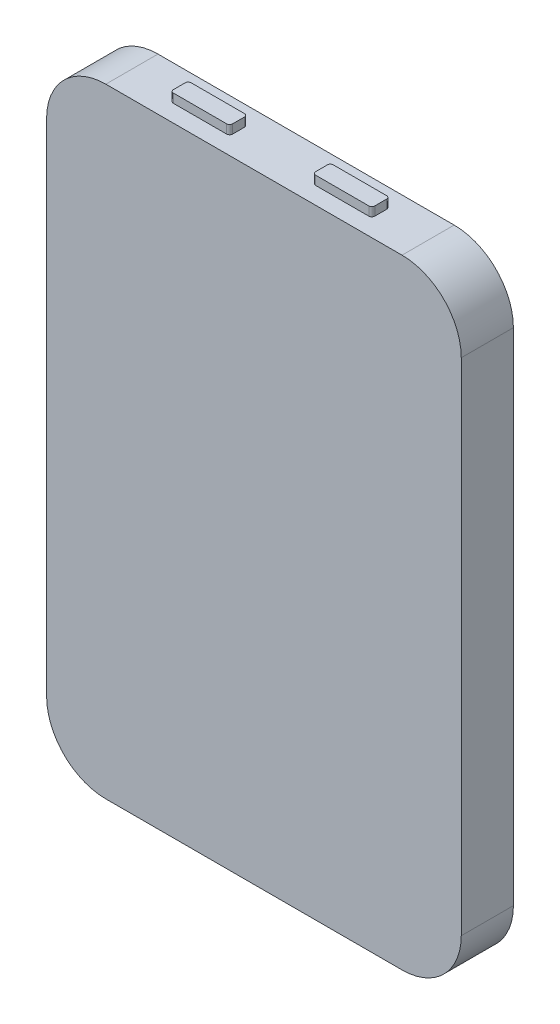
ISO-10303-21;
HEADER;
FILE_DESCRIPTION(('STEP AP214'),'2;1');
FILE_NAME('part.step','',(''),(''),'','','');
FILE_SCHEMA(('AUTOMOTIVE_DESIGN { 1 0 10303 214 1 1 1 1 }'));
ENDSEC;
DATA;
#1=APPLICATION_CONTEXT('core data for automotive mechanical design processes');
#2=APPLICATION_PROTOCOL_DEFINITION('international standard','automotive_design',2000,#1);
#3=PRODUCT_CONTEXT('',#1,'mechanical');
#4=PRODUCT('Part','Part','',(#3));
#5=PRODUCT_RELATED_PRODUCT_CATEGORY('part','',(#4));
#6=PRODUCT_DEFINITION_FORMATION('','',#4);
#7=PRODUCT_DEFINITION_CONTEXT('part definition',#1,'design');
#8=PRODUCT_DEFINITION('design','',#6,#7);
#9=PRODUCT_DEFINITION_SHAPE('','',#8);
#10=(LENGTH_UNIT() NAMED_UNIT(*) SI_UNIT(.MILLI.,.METRE.));
#11=(NAMED_UNIT(*) PLANE_ANGLE_UNIT() SI_UNIT($,.RADIAN.));
#12=(NAMED_UNIT(*) SI_UNIT($,.STERADIAN.) SOLID_ANGLE_UNIT());
#13=UNCERTAINTY_MEASURE_WITH_UNIT(LENGTH_MEASURE(1.E-05),#10,'distance_accuracy_value','');
#14=(GEOMETRIC_REPRESENTATION_CONTEXT(3) GLOBAL_UNCERTAINTY_ASSIGNED_CONTEXT((#13)) GLOBAL_UNIT_ASSIGNED_CONTEXT((#10,
#11,#12)) REPRESENTATION_CONTEXT('',''));
#15=CARTESIAN_POINT('',(0.,0.,0.));
#16=DIRECTION('',(0.,0.,1.));
#17=DIRECTION('',(1.,0.,0.));
#18=AXIS2_PLACEMENT_3D('',#15,#16,#17);
#19=CARTESIAN_POINT('',(-24.9999999999999,52.25,8.8));
#20=DIRECTION('',(0.,-1.,0.));
#21=DIRECTION('',(0.,0.,-1.));
#22=AXIS2_PLACEMENT_3D('',#19,#20,#21);
#23=PLANE('',#22);
#24=CARTESIAN_POINT('',(16.5,52.25,5.40000000000001));
#25=DIRECTION('',(0.,1.,0.));
#26=DIRECTION('',(0.,0.,1.));
#27=AXIS2_PLACEMENT_3D('',#24,#25,#26);
#28=CIRCLE('',#27,0.5);
#29=CARTESIAN_POINT('',(16.5,52.25,5.90000000000001));
#30=VERTEX_POINT('',#29);
#31=CARTESIAN_POINT('',(17.,52.25,5.40000000000001));
#32=VERTEX_POINT('',#31);
#33=EDGE_CURVE('E225',#30,#32,#28,.T.);
#34=ORIENTED_EDGE('',*,*,#33,.F.);
#35=DIRECTION('',(1.,0.,0.));
#36=VECTOR('',#35,1.);
#37=CARTESIAN_POINT('',(7.50000000000002,52.25,5.90000000000001));
#38=LINE('',#37,#36);
#39=CARTESIAN_POINT('',(7.50000000000003,52.25,5.90000000000001));
#40=VERTEX_POINT('',#39);
#41=EDGE_CURVE('E241',#40,#30,#38,.T.);
#42=ORIENTED_EDGE('',*,*,#41,.F.);
#43=CARTESIAN_POINT('',(7.50000000000002,52.25,5.40000000000001));
#44=DIRECTION('',(0.,1.,0.));
#45=DIRECTION('',(0.,0.,1.));
#46=AXIS2_PLACEMENT_3D('',#43,#44,#45);
#47=CIRCLE('',#46,0.5);
#48=CARTESIAN_POINT('',(7.00000000000002,52.25,5.40000000000001));
#49=VERTEX_POINT('',#48);
#50=EDGE_CURVE('E282',#49,#40,#47,.T.);
#51=ORIENTED_EDGE('',*,*,#50,.F.);
#52=DIRECTION('',(0.,0.,1.));
#53=VECTOR('',#52,1.);
#54=CARTESIAN_POINT('',(7.00000000000002,52.25,5.40000000000001));
#55=LINE('',#54,#53);
#56=CARTESIAN_POINT('',(7.00000000000002,52.25,3.40000000000001));
#57=VERTEX_POINT('',#56);
#58=EDGE_CURVE('E278',#57,#49,#55,.T.);
#59=ORIENTED_EDGE('',*,*,#58,.F.);
#60=CARTESIAN_POINT('',(7.50000000000002,52.25,3.40000000000001));
#61=DIRECTION('',(0.,1.,0.));
#62=DIRECTION('',(0.,0.,-1.));
#63=AXIS2_PLACEMENT_3D('',#60,#61,#62);
#64=CIRCLE('',#63,0.5);
#65=CARTESIAN_POINT('',(7.50000000000002,52.25,2.90000000000001));
#66=VERTEX_POINT('',#65);
#67=EDGE_CURVE('E274',#66,#57,#64,.T.);
#68=ORIENTED_EDGE('',*,*,#67,.F.);
#69=DIRECTION('',(-1.,0.,0.));
#70=VECTOR('',#69,1.);
#71=CARTESIAN_POINT('',(7.50000000000002,52.25,2.90000000000001));
#72=LINE('',#71,#70);
#73=CARTESIAN_POINT('',(16.5,52.25,2.90000000000001));
#74=VERTEX_POINT('',#73);
#75=EDGE_CURVE('E270',#74,#66,#72,.T.);
#76=ORIENTED_EDGE('',*,*,#75,.F.);
#77=CARTESIAN_POINT('',(16.5,52.25,3.40000000000001));
#78=DIRECTION('',(0.,1.,0.));
#79=DIRECTION('',(0.,0.,1.));
#80=AXIS2_PLACEMENT_3D('',#77,#78,#79);
#81=CIRCLE('',#80,0.5);
#82=CARTESIAN_POINT('',(17.,52.25,3.40000000000001));
#83=VERTEX_POINT('',#82);
#84=EDGE_CURVE('E266',#83,#74,#81,.T.);
#85=ORIENTED_EDGE('',*,*,#84,.F.);
#86=DIRECTION('',(0.,0.,-1.));
#87=VECTOR('',#86,1.);
#88=CARTESIAN_POINT('',(17.,52.25,5.40000000000001));
#89=LINE('',#88,#87);
#90=EDGE_CURVE('E230',#32,#83,#89,.T.);
#91=ORIENTED_EDGE('',*,*,#90,.F.);
#92=EDGE_LOOP('',(#34,#42,#51,#59,#68,#76,#85,#91));
#93=FACE_BOUND('',#92,.T.);
#94=DIRECTION('',(-1.,0.,0.));
#95=VECTOR('',#94,1.);
#96=CARTESIAN_POINT('',(-24.9999999999999,52.25,0.));
#97=LINE('',#96,#95);
#98=CARTESIAN_POINT('',(25.,52.25,0.));
#99=VERTEX_POINT('',#98);
#100=CARTESIAN_POINT('',(-24.9999999999999,52.25,0.));
#101=VERTEX_POINT('',#100);
#102=EDGE_CURVE('E351',#99,#101,#97,.T.);
#103=ORIENTED_EDGE('',*,*,#102,.T.);
#104=DIRECTION('',(0.,0.,-1.));
#105=VECTOR('',#104,1.);
#106=CARTESIAN_POINT('',(-24.9999999999999,52.25,8.8));
#107=LINE('',#106,#105);
#108=CARTESIAN_POINT('',(-24.9999999999999,52.25,8.8));
#109=VERTEX_POINT('',#108);
#110=EDGE_CURVE('E48',#109,#101,#107,.T.);
#111=ORIENTED_EDGE('',*,*,#110,.F.);
#112=DIRECTION('',(-1.,0.,0.));
#113=VECTOR('',#112,1.);
#114=CARTESIAN_POINT('',(-24.9999999999999,52.25,8.8));
#115=LINE('',#114,#113);
#116=CARTESIAN_POINT('',(25.,52.25,8.8));
#117=VERTEX_POINT('',#116);
#118=EDGE_CURVE('E325',#117,#109,#115,.T.);
#119=ORIENTED_EDGE('',*,*,#118,.F.);
#120=DIRECTION('',(0.,0.,-1.));
#121=VECTOR('',#120,1.);
#122=CARTESIAN_POINT('',(25.,52.25,8.8));
#123=LINE('',#122,#121);
#124=EDGE_CURVE('E11',#117,#99,#123,.T.);
#125=ORIENTED_EDGE('',*,*,#124,.T.);
#126=EDGE_LOOP('',(#103,#111,#119,#125));
#127=FACE_BOUND('',#126,.T.);
#128=CARTESIAN_POINT('',(-7.49999999999998,52.25,3.40000000000001));
#129=DIRECTION('',(0.,1.,0.));
#130=DIRECTION('',(0.,0.,1.));
#131=AXIS2_PLACEMENT_3D('',#128,#129,#130);
#132=CIRCLE('',#131,0.5);
#133=CARTESIAN_POINT('',(-6.99999999999998,52.25,3.40000000000001));
#134=VERTEX_POINT('',#133);
#135=CARTESIAN_POINT('',(-7.49999999999999,52.25,2.90000000000001));
#136=VERTEX_POINT('',#135);
#137=EDGE_CURVE('E223',#134,#136,#132,.T.);
#138=ORIENTED_EDGE('',*,*,#137,.F.);
#139=DIRECTION('',(0.,0.,-1.));
#140=VECTOR('',#139,1.);
#141=CARTESIAN_POINT('',(-6.99999999999998,52.25,5.40000000000001));
#142=LINE('',#141,#140);
#143=CARTESIAN_POINT('',(-6.99999999999999,52.25,5.40000000000001));
#144=VERTEX_POINT('',#143);
#145=EDGE_CURVE('E220',#144,#134,#142,.T.);
#146=ORIENTED_EDGE('',*,*,#145,.F.);
#147=CARTESIAN_POINT('',(-7.49999999999998,52.25,5.40000000000001));
#148=DIRECTION('',(0.,1.,0.));
#149=DIRECTION('',(0.,0.,1.));
#150=AXIS2_PLACEMENT_3D('',#147,#148,#149);
#151=CIRCLE('',#150,0.5);
#152=CARTESIAN_POINT('',(-7.49999999999999,52.25,5.90000000000001));
#153=VERTEX_POINT('',#152);
#154=EDGE_CURVE('E842',#153,#144,#151,.T.);
#155=ORIENTED_EDGE('',*,*,#154,.F.);
#156=DIRECTION('',(1.,0.,0.));
#157=VECTOR('',#156,1.);
#158=CARTESIAN_POINT('',(-16.5,52.25,5.90000000000001));
#159=LINE('',#158,#157);
#160=CARTESIAN_POINT('',(-16.5,52.25,5.90000000000001));
#161=VERTEX_POINT('',#160);
#162=EDGE_CURVE('E838',#161,#153,#159,.T.);
#163=ORIENTED_EDGE('',*,*,#162,.F.);
#164=CARTESIAN_POINT('',(-16.5,52.25,5.40000000000001));
#165=DIRECTION('',(0.,1.,0.));
#166=DIRECTION('',(0.,0.,1.));
#167=AXIS2_PLACEMENT_3D('',#164,#165,#166);
#168=CIRCLE('',#167,0.5);
#169=CARTESIAN_POINT('',(-17.,52.25,5.40000000000001));
#170=VERTEX_POINT('',#169);
#171=EDGE_CURVE('E834',#170,#161,#168,.T.);
#172=ORIENTED_EDGE('',*,*,#171,.F.);
#173=DIRECTION('',(0.,0.,1.));
#174=VECTOR('',#173,1.);
#175=CARTESIAN_POINT('',(-17.,52.25,5.40000000000001));
#176=LINE('',#175,#174);
#177=CARTESIAN_POINT('',(-17.,52.25,3.40000000000001));
#178=VERTEX_POINT('',#177);
#179=EDGE_CURVE('E830',#178,#170,#176,.T.);
#180=ORIENTED_EDGE('',*,*,#179,.F.);
#181=CARTESIAN_POINT('',(-16.5,52.25,3.40000000000001));
#182=DIRECTION('',(0.,1.,0.));
#183=DIRECTION('',(0.,0.,-1.));
#184=AXIS2_PLACEMENT_3D('',#181,#182,#183);
#185=CIRCLE('',#184,0.5);
#186=CARTESIAN_POINT('',(-16.5,52.25,2.90000000000001));
#187=VERTEX_POINT('',#186);
#188=EDGE_CURVE('E60',#187,#178,#185,.T.);
#189=ORIENTED_EDGE('',*,*,#188,.F.);
#190=DIRECTION('',(-1.,0.,0.));
#191=VECTOR('',#190,1.);
#192=CARTESIAN_POINT('',(-16.5,52.25,2.90000000000001));
#193=LINE('',#192,#191);
#194=EDGE_CURVE('E55',#136,#187,#193,.T.);
#195=ORIENTED_EDGE('',*,*,#194,.F.);
#196=EDGE_LOOP('',(#138,#146,#155,#163,#172,#180,#189,#195));
#197=FACE_BOUND('',#196,.T.);
#198=ADVANCED_FACE('F39',(#93,#127,#197),#23,.F.);
#199=CARTESIAN_POINT('',(25.,42.25,8.8));
#200=DIRECTION('',(0.,0.,-1.));
#201=DIRECTION('',(-1.,0.,0.));
#202=AXIS2_PLACEMENT_3D('',#199,#200,#201);
#203=CYLINDRICAL_SURFACE('',#202,10.);
#204=CARTESIAN_POINT('',(25.,42.25,0.));
#205=DIRECTION('',(0.,0.,1.));
#206=DIRECTION('',(1.,0.,0.));
#207=AXIS2_PLACEMENT_3D('',#204,#205,#206);
#208=CIRCLE('',#207,10.);
#209=CARTESIAN_POINT('',(35.,42.2499999999999,0.));
#210=VERTEX_POINT('',#209);
#211=EDGE_CURVE('E320',#210,#99,#208,.T.);
#212=ORIENTED_EDGE('',*,*,#211,.T.);
#213=ORIENTED_EDGE('',*,*,#124,.F.);
#214=CARTESIAN_POINT('',(25.,42.25,8.8));
#215=DIRECTION('',(0.,0.,1.));
#216=DIRECTION('',(1.,0.,0.));
#217=AXIS2_PLACEMENT_3D('',#214,#215,#216);
#218=CIRCLE('',#217,10.);
#219=CARTESIAN_POINT('',(35.,42.2499999999999,8.8));
#220=VERTEX_POINT('',#219);
#221=EDGE_CURVE('E321',#220,#117,#218,.T.);
#222=ORIENTED_EDGE('',*,*,#221,.F.);
#223=DIRECTION('',(0.,0.,-1.));
#224=VECTOR('',#223,1.);
#225=CARTESIAN_POINT('',(35.,42.2499999999999,8.8));
#226=LINE('',#225,#224);
#227=EDGE_CURVE('E347',#220,#210,#226,.T.);
#228=ORIENTED_EDGE('',*,*,#227,.T.);
#229=EDGE_LOOP('',(#212,#213,#222,#228));
#230=FACE_BOUND('',#229,.T.);
#231=ADVANCED_FACE('F41',(#230),#203,.T.);
#232=CARTESIAN_POINT('',(-25.,42.25,8.8));
#233=DIRECTION('',(0.,0.,-1.));
#234=DIRECTION('',(-1.,0.,0.));
#235=AXIS2_PLACEMENT_3D('',#232,#233,#234);
#236=CYLINDRICAL_SURFACE('',#235,10.);
#237=CARTESIAN_POINT('',(-25.,42.25,0.));
#238=DIRECTION('',(0.,0.,1.));
#239=DIRECTION('',(-1.,0.,0.));
#240=AXIS2_PLACEMENT_3D('',#237,#238,#239);
#241=CIRCLE('',#240,10.);
#242=CARTESIAN_POINT('',(-35.,42.2499999999999,0.));
#243=VERTEX_POINT('',#242);
#244=EDGE_CURVE('E354',#101,#243,#241,.T.);
#245=ORIENTED_EDGE('',*,*,#244,.T.);
#246=DIRECTION('',(0.,0.,-1.));
#247=VECTOR('',#246,1.);
#248=CARTESIAN_POINT('',(-35.,42.2499999999999,8.8));
#249=LINE('',#248,#247);
#250=CARTESIAN_POINT('',(-35.,42.2499999999999,8.8));
#251=VERTEX_POINT('',#250);
#252=EDGE_CURVE('E390',#251,#243,#249,.T.);
#253=ORIENTED_EDGE('',*,*,#252,.F.);
#254=CARTESIAN_POINT('',(-25.,42.25,8.8));
#255=DIRECTION('',(0.,0.,1.));
#256=DIRECTION('',(-1.,0.,0.));
#257=AXIS2_PLACEMENT_3D('',#254,#255,#256);
#258=CIRCLE('',#257,10.);
#259=EDGE_CURVE('E329',#109,#251,#258,.T.);
#260=ORIENTED_EDGE('',*,*,#259,.F.);
#261=ORIENTED_EDGE('',*,*,#110,.T.);
#262=EDGE_LOOP('',(#245,#253,#260,#261));
#263=FACE_BOUND('',#262,.T.);
#264=ADVANCED_FACE('F399',(#263),#236,.T.);
#265=CARTESIAN_POINT('',(-35.,-42.2499999999999,8.8));
#266=DIRECTION('',(1.,0.,0.));
#267=DIRECTION('',(0.,0.,-1.));
#268=AXIS2_PLACEMENT_3D('',#265,#266,#267);
#269=PLANE('',#268);
#270=DIRECTION('',(0.,-1.,0.));
#271=VECTOR('',#270,1.);
#272=CARTESIAN_POINT('',(-35.,-42.2499999999999,0.));
#273=LINE('',#272,#271);
#274=CARTESIAN_POINT('',(-35.,-42.25,0.));
#275=VERTEX_POINT('',#274);
#276=EDGE_CURVE('E357',#243,#275,#273,.T.);
#277=ORIENTED_EDGE('',*,*,#276,.T.);
#278=DIRECTION('',(0.,0.,-1.));
#279=VECTOR('',#278,1.);
#280=CARTESIAN_POINT('',(-35.,-42.25,8.8));
#281=LINE('',#280,#279);
#282=CARTESIAN_POINT('',(-35.,-42.25,8.8));
#283=VERTEX_POINT('',#282);
#284=EDGE_CURVE('E386',#283,#275,#281,.T.);
#285=ORIENTED_EDGE('',*,*,#284,.F.);
#286=DIRECTION('',(0.,-1.,0.));
#287=VECTOR('',#286,1.);
#288=CARTESIAN_POINT('',(-35.,-42.2499999999999,8.8));
#289=LINE('',#288,#287);
#290=EDGE_CURVE('E332',#251,#283,#289,.T.);
#291=ORIENTED_EDGE('',*,*,#290,.F.);
#292=ORIENTED_EDGE('',*,*,#252,.T.);
#293=EDGE_LOOP('',(#277,#285,#291,#292));
#294=FACE_BOUND('',#293,.T.);
#295=ADVANCED_FACE('F410',(#294),#269,.F.);
#296=CARTESIAN_POINT('',(-25.,-42.25,8.8));
#297=DIRECTION('',(0.,0.,-1.));
#298=DIRECTION('',(-1.,0.,0.));
#299=AXIS2_PLACEMENT_3D('',#296,#297,#298);
#300=CYLINDRICAL_SURFACE('',#299,10.);
#301=CARTESIAN_POINT('',(-25.,-42.25,0.));
#302=DIRECTION('',(0.,0.,1.));
#303=DIRECTION('',(-1.,0.,0.));
#304=AXIS2_PLACEMENT_3D('',#301,#302,#303);
#305=CIRCLE('',#304,10.);
#306=CARTESIAN_POINT('',(-24.9999999999999,-52.25,0.));
#307=VERTEX_POINT('',#306);
#308=EDGE_CURVE('E360',#275,#307,#305,.T.);
#309=ORIENTED_EDGE('',*,*,#308,.T.);
#310=DIRECTION('',(0.,0.,-1.));
#311=VECTOR('',#310,1.);
#312=CARTESIAN_POINT('',(-24.9999999999999,-52.25,8.8));
#313=LINE('',#312,#311);
#314=CARTESIAN_POINT('',(-24.9999999999999,-52.25,8.8));
#315=VERTEX_POINT('',#314);
#316=EDGE_CURVE('E382',#315,#307,#313,.T.);
#317=ORIENTED_EDGE('',*,*,#316,.F.);
#318=CARTESIAN_POINT('',(-25.,-42.25,8.8));
#319=DIRECTION('',(0.,0.,1.));
#320=DIRECTION('',(-1.,0.,0.));
#321=AXIS2_PLACEMENT_3D('',#318,#319,#320);
#322=CIRCLE('',#321,10.);
#323=EDGE_CURVE('E335',#283,#315,#322,.T.);
#324=ORIENTED_EDGE('',*,*,#323,.F.);
#325=ORIENTED_EDGE('',*,*,#284,.T.);
#326=EDGE_LOOP('',(#309,#317,#324,#325));
#327=FACE_BOUND('',#326,.T.);
#328=ADVANCED_FACE('F414',(#327),#300,.T.);
#329=CARTESIAN_POINT('',(-24.9999999999999,-52.25,8.8));
#330=DIRECTION('',(0.,1.,0.));
#331=DIRECTION('',(0.,0.,1.));
#332=AXIS2_PLACEMENT_3D('',#329,#330,#331);
#333=PLANE('',#332);
#334=DIRECTION('',(1.,0.,0.));
#335=VECTOR('',#334,1.);
#336=CARTESIAN_POINT('',(-24.9999999999999,-52.25,0.));
#337=LINE('',#336,#335);
#338=CARTESIAN_POINT('',(25.,-52.25,0.));
#339=VERTEX_POINT('',#338);
#340=EDGE_CURVE('E363',#307,#339,#337,.T.);
#341=ORIENTED_EDGE('',*,*,#340,.T.);
#342=DIRECTION('',(0.,0.,-1.));
#343=VECTOR('',#342,1.);
#344=CARTESIAN_POINT('',(25.,-52.25,8.8));
#345=LINE('',#344,#343);
#346=CARTESIAN_POINT('',(25.,-52.25,8.8));
#347=VERTEX_POINT('',#346);
#348=EDGE_CURVE('E378',#347,#339,#345,.T.);
#349=ORIENTED_EDGE('',*,*,#348,.F.);
#350=DIRECTION('',(1.,0.,0.));
#351=VECTOR('',#350,1.);
#352=CARTESIAN_POINT('',(-24.9999999999999,-52.25,8.8));
#353=LINE('',#352,#351);
#354=EDGE_CURVE('E338',#315,#347,#353,.T.);
#355=ORIENTED_EDGE('',*,*,#354,.F.);
#356=ORIENTED_EDGE('',*,*,#316,.T.);
#357=EDGE_LOOP('',(#341,#349,#355,#356));
#358=FACE_BOUND('',#357,.T.);
#359=ADVANCED_FACE('F434',(#358),#333,.F.);
#360=CARTESIAN_POINT('',(25.,-42.25,8.8));
#361=DIRECTION('',(0.,0.,-1.));
#362=DIRECTION('',(-1.,0.,0.));
#363=AXIS2_PLACEMENT_3D('',#360,#361,#362);
#364=CYLINDRICAL_SURFACE('',#363,10.);
#365=CARTESIAN_POINT('',(25.,-42.25,0.));
#366=DIRECTION('',(0.,0.,1.));
#367=DIRECTION('',(1.,0.,0.));
#368=AXIS2_PLACEMENT_3D('',#365,#366,#367);
#369=CIRCLE('',#368,10.);
#370=CARTESIAN_POINT('',(35.,-42.2499999999999,0.));
#371=VERTEX_POINT('',#370);
#372=EDGE_CURVE('E366',#339,#371,#369,.T.);
#373=ORIENTED_EDGE('',*,*,#372,.T.);
#374=DIRECTION('',(0.,0.,-1.));
#375=VECTOR('',#374,1.);
#376=CARTESIAN_POINT('',(35.,-42.2499999999999,8.8));
#377=LINE('',#376,#375);
#378=CARTESIAN_POINT('',(35.,-42.2499999999999,8.8));
#379=VERTEX_POINT('',#378);
#380=EDGE_CURVE('E374',#379,#371,#377,.T.);
#381=ORIENTED_EDGE('',*,*,#380,.F.);
#382=CARTESIAN_POINT('',(25.,-42.25,8.8));
#383=DIRECTION('',(0.,0.,1.));
#384=DIRECTION('',(1.,0.,0.));
#385=AXIS2_PLACEMENT_3D('',#382,#383,#384);
#386=CIRCLE('',#385,10.);
#387=EDGE_CURVE('E341',#347,#379,#386,.T.);
#388=ORIENTED_EDGE('',*,*,#387,.F.);
#389=ORIENTED_EDGE('',*,*,#348,.T.);
#390=EDGE_LOOP('',(#373,#381,#388,#389));
#391=FACE_BOUND('',#390,.T.);
#392=ADVANCED_FACE('F432',(#391),#364,.T.);
#393=CARTESIAN_POINT('',(35.,-42.2499999999999,8.8));
#394=DIRECTION('',(-1.,0.,0.));
#395=DIRECTION('',(0.,0.,1.));
#396=AXIS2_PLACEMENT_3D('',#393,#394,#395);
#397=PLANE('',#396);
#398=DIRECTION('',(0.,1.,0.));
#399=VECTOR('',#398,1.);
#400=CARTESIAN_POINT('',(35.,-42.2499999999999,0.));
#401=LINE('',#400,#399);
#402=EDGE_CURVE('E326',#371,#210,#401,.T.);
#403=ORIENTED_EDGE('',*,*,#402,.T.);
#404=ORIENTED_EDGE('',*,*,#227,.F.);
#405=DIRECTION('',(0.,1.,0.));
#406=VECTOR('',#405,1.);
#407=CARTESIAN_POINT('',(35.,-42.2499999999999,8.8));
#408=LINE('',#407,#406);
#409=EDGE_CURVE('E344',#379,#220,#408,.T.);
#410=ORIENTED_EDGE('',*,*,#409,.F.);
#411=ORIENTED_EDGE('',*,*,#380,.T.);
#412=EDGE_LOOP('',(#403,#404,#410,#411));
#413=FACE_BOUND('',#412,.T.);
#414=ADVANCED_FACE('F427',(#413),#397,.F.);
#415=CARTESIAN_POINT('',(25.,42.25,8.8));
#416=DIRECTION('',(0.,0.,1.));
#417=DIRECTION('',(1.,0.,0.));
#418=AXIS2_PLACEMENT_3D('',#415,#416,#417);
#419=PLANE('',#418);
#420=ORIENTED_EDGE('',*,*,#221,.T.);
#421=ORIENTED_EDGE('',*,*,#118,.T.);
#422=ORIENTED_EDGE('',*,*,#259,.T.);
#423=ORIENTED_EDGE('',*,*,#290,.T.);
#424=ORIENTED_EDGE('',*,*,#323,.T.);
#425=ORIENTED_EDGE('',*,*,#354,.T.);
#426=ORIENTED_EDGE('',*,*,#387,.T.);
#427=ORIENTED_EDGE('',*,*,#409,.T.);
#428=EDGE_LOOP('',(#420,#421,#422,#423,#424,#425,#426,#427));
#429=FACE_BOUND('',#428,.T.);
#430=ADVANCED_FACE('F418',(#429),#419,.T.);
#431=CARTESIAN_POINT('',(25.,42.25,0.));
#432=DIRECTION('',(0.,0.,1.));
#433=DIRECTION('',(1.,0.,0.));
#434=AXIS2_PLACEMENT_3D('',#431,#432,#433);
#435=PLANE('',#434);
#436=CARTESIAN_POINT('',(2.,48.3706955968913,0.));
#437=DIRECTION('',(0.,0.,-1.));
#438=DIRECTION('',(-1.,0.,0.));
#439=AXIS2_PLACEMENT_3D('',#436,#437,#438);
#440=CIRCLE('',#439,0.502704904962618);
#441=CARTESIAN_POINT('',(1.49729509503738,48.3706955968913,0.));
#442=VERTEX_POINT('',#441);
#443=EDGE_CURVE('E782',#442,#442,#440,.T.);
#444=ORIENTED_EDGE('',*,*,#443,.F.);
#445=EDGE_LOOP('',(#444));
#446=FACE_BOUND('',#445,.T.);
#447=CARTESIAN_POINT('',(-4.,48.3706955968913,0.));
#448=DIRECTION('',(0.,0.,-1.));
#449=DIRECTION('',(-1.,0.,0.));
#450=AXIS2_PLACEMENT_3D('',#447,#448,#449);
#451=CIRCLE('',#450,0.5);
#452=CARTESIAN_POINT('',(-4.5,48.3706955968913,0.));
#453=VERTEX_POINT('',#452);
#454=EDGE_CURVE('E799',#453,#453,#451,.T.);
#455=ORIENTED_EDGE('',*,*,#454,.F.);
#456=EDGE_LOOP('',(#455));
#457=FACE_BOUND('',#456,.T.);
#458=CARTESIAN_POINT('',(-2.,48.3706955968913,0.));
#459=DIRECTION('',(0.,0.,-1.));
#460=DIRECTION('',(-1.,0.,0.));
#461=AXIS2_PLACEMENT_3D('',#458,#459,#460);
#462=CIRCLE('',#461,0.502704904962618);
#463=CARTESIAN_POINT('',(-2.50270490496262,48.3706955968913,0.));
#464=VERTEX_POINT('',#463);
#465=EDGE_CURVE('E885',#464,#464,#462,.T.);
#466=ORIENTED_EDGE('',*,*,#465,.F.);
#467=EDGE_LOOP('',(#466));
#468=FACE_BOUND('',#467,.T.);
#469=CARTESIAN_POINT('',(4.,48.3706955968913,0.));
#470=DIRECTION('',(0.,0.,-1.));
#471=DIRECTION('',(-1.,0.,0.));
#472=AXIS2_PLACEMENT_3D('',#469,#470,#471);
#473=CIRCLE('',#472,0.502704904962618);
#474=CARTESIAN_POINT('',(3.49729509503738,48.3706955968913,0.));
#475=VERTEX_POINT('',#474);
#476=EDGE_CURVE('E793',#475,#475,#473,.T.);
#477=ORIENTED_EDGE('',*,*,#476,.F.);
#478=EDGE_LOOP('',(#477));
#479=FACE_BOUND('',#478,.T.);
#480=CARTESIAN_POINT('',(0.,48.3706955968913,0.));
#481=DIRECTION('',(0.,0.,-1.));
#482=DIRECTION('',(-1.,0.,0.));
#483=AXIS2_PLACEMENT_3D('',#480,#481,#482);
#484=CIRCLE('',#483,0.5);
#485=CARTESIAN_POINT('',(-0.5,48.3706955968913,0.));
#486=VERTEX_POINT('',#485);
#487=EDGE_CURVE('E781',#486,#486,#484,.T.);
#488=ORIENTED_EDGE('',*,*,#487,.F.);
#489=EDGE_LOOP('',(#488));
#490=FACE_BOUND('',#489,.T.);
#491=ORIENTED_EDGE('',*,*,#211,.F.);
#492=ORIENTED_EDGE('',*,*,#402,.F.);
#493=ORIENTED_EDGE('',*,*,#372,.F.);
#494=ORIENTED_EDGE('',*,*,#340,.F.);
#495=ORIENTED_EDGE('',*,*,#308,.F.);
#496=ORIENTED_EDGE('',*,*,#276,.F.);
#497=ORIENTED_EDGE('',*,*,#244,.F.);
#498=ORIENTED_EDGE('',*,*,#102,.F.);
#499=EDGE_LOOP('',(#491,#492,#493,#494,#495,#496,#497,#498));
#500=FACE_BOUND('',#499,.T.);
#501=ADVANCED_FACE('F405',(#446,#457,#468,#479,#490,#500),#435,.F.);
#502=CARTESIAN_POINT('',(16.5,53.75,5.40000000000001));
#503=DIRECTION('',(0.,-1.,0.));
#504=DIRECTION('',(0.,0.,-1.));
#505=AXIS2_PLACEMENT_3D('',#502,#503,#504);
#506=CYLINDRICAL_SURFACE('',#505,0.5);
#507=ORIENTED_EDGE('',*,*,#33,.T.);
#508=DIRECTION('',(0.,-1.,0.));
#509=VECTOR('',#508,1.);
#510=CARTESIAN_POINT('',(17.,53.75,5.40000000000001));
#511=LINE('',#510,#509);
#512=CARTESIAN_POINT('',(17.,53.75,5.40000000000001));
#513=VERTEX_POINT('',#512);
#514=EDGE_CURVE('E316',#513,#32,#511,.T.);
#515=ORIENTED_EDGE('',*,*,#514,.F.);
#516=CARTESIAN_POINT('',(16.5,53.75,5.40000000000001));
#517=DIRECTION('',(0.,1.,0.));
#518=DIRECTION('',(0.,0.,1.));
#519=AXIS2_PLACEMENT_3D('',#516,#517,#518);
#520=CIRCLE('',#519,0.5);
#521=CARTESIAN_POINT('',(16.5,53.75,5.90000000000001));
#522=VERTEX_POINT('',#521);
#523=EDGE_CURVE('E236',#522,#513,#520,.T.);
#524=ORIENTED_EDGE('',*,*,#523,.F.);
#525=DIRECTION('',(0.,-1.,0.));
#526=VECTOR('',#525,1.);
#527=CARTESIAN_POINT('',(16.5,53.75,5.90000000000001));
#528=LINE('',#527,#526);
#529=EDGE_CURVE('E261',#522,#30,#528,.T.);
#530=ORIENTED_EDGE('',*,*,#529,.T.);
#531=EDGE_LOOP('',(#507,#515,#524,#530));
#532=FACE_BOUND('',#531,.T.);
#533=ADVANCED_FACE('F498',(#532),#506,.T.);
#534=CARTESIAN_POINT('',(17.,53.75,5.40000000000001));
#535=DIRECTION('',(-1.,0.,0.));
#536=DIRECTION('',(0.,0.,1.));
#537=AXIS2_PLACEMENT_3D('',#534,#535,#536);
#538=PLANE('',#537);
#539=ORIENTED_EDGE('',*,*,#90,.T.);
#540=DIRECTION('',(0.,-1.,0.));
#541=VECTOR('',#540,1.);
#542=CARTESIAN_POINT('',(17.,53.75,3.40000000000001));
#543=LINE('',#542,#541);
#544=CARTESIAN_POINT('',(17.,53.75,3.40000000000001));
#545=VERTEX_POINT('',#544);
#546=EDGE_CURVE('E312',#545,#83,#543,.T.);
#547=ORIENTED_EDGE('',*,*,#546,.F.);
#548=DIRECTION('',(0.,0.,-1.));
#549=VECTOR('',#548,1.);
#550=CARTESIAN_POINT('',(17.,53.75,5.40000000000001));
#551=LINE('',#550,#549);
#552=EDGE_CURVE('E240',#513,#545,#551,.T.);
#553=ORIENTED_EDGE('',*,*,#552,.F.);
#554=ORIENTED_EDGE('',*,*,#514,.T.);
#555=EDGE_LOOP('',(#539,#547,#553,#554));
#556=FACE_BOUND('',#555,.T.);
#557=ADVANCED_FACE('F502',(#556),#538,.F.);
#558=CARTESIAN_POINT('',(16.5,53.75,3.40000000000001));
#559=DIRECTION('',(0.,-1.,0.));
#560=DIRECTION('',(0.,0.,-1.));
#561=AXIS2_PLACEMENT_3D('',#558,#559,#560);
#562=CYLINDRICAL_SURFACE('',#561,0.5);
#563=ORIENTED_EDGE('',*,*,#84,.T.);
#564=DIRECTION('',(0.,-1.,0.));
#565=VECTOR('',#564,1.);
#566=CARTESIAN_POINT('',(16.5,53.75,2.90000000000001));
#567=LINE('',#566,#565);
#568=CARTESIAN_POINT('',(16.5,53.75,2.90000000000001));
#569=VERTEX_POINT('',#568);
#570=EDGE_CURVE('E308',#569,#74,#567,.T.);
#571=ORIENTED_EDGE('',*,*,#570,.F.);
#572=CARTESIAN_POINT('',(16.5,53.75,3.40000000000001));
#573=DIRECTION('',(0.,1.,0.));
#574=DIRECTION('',(0.,0.,1.));
#575=AXIS2_PLACEMENT_3D('',#572,#573,#574);
#576=CIRCLE('',#575,0.5);
#577=EDGE_CURVE('E244',#545,#569,#576,.T.);
#578=ORIENTED_EDGE('',*,*,#577,.F.);
#579=ORIENTED_EDGE('',*,*,#546,.T.);
#580=EDGE_LOOP('',(#563,#571,#578,#579));
#581=FACE_BOUND('',#580,.T.);
#582=ADVANCED_FACE('F512',(#581),#562,.T.);
#583=CARTESIAN_POINT('',(7.50000000000002,53.75,2.90000000000001));
#584=DIRECTION('',(0.,0.,1.));
#585=DIRECTION('',(1.,0.,0.));
#586=AXIS2_PLACEMENT_3D('',#583,#584,#585);
#587=PLANE('',#586);
#588=ORIENTED_EDGE('',*,*,#75,.T.);
#589=DIRECTION('',(0.,-1.,0.));
#590=VECTOR('',#589,1.);
#591=CARTESIAN_POINT('',(7.50000000000002,53.75,2.90000000000001));
#592=LINE('',#591,#590);
#593=CARTESIAN_POINT('',(7.50000000000002,53.75,2.90000000000001));
#594=VERTEX_POINT('',#593);
#595=EDGE_CURVE('E304',#594,#66,#592,.T.);
#596=ORIENTED_EDGE('',*,*,#595,.F.);
#597=DIRECTION('',(-1.,0.,0.));
#598=VECTOR('',#597,1.);
#599=CARTESIAN_POINT('',(7.50000000000002,53.75,2.90000000000001));
#600=LINE('',#599,#598);
#601=EDGE_CURVE('E247',#569,#594,#600,.T.);
#602=ORIENTED_EDGE('',*,*,#601,.F.);
#603=ORIENTED_EDGE('',*,*,#570,.T.);
#604=EDGE_LOOP('',(#588,#596,#602,#603));
#605=FACE_BOUND('',#604,.T.);
#606=ADVANCED_FACE('F522',(#605),#587,.F.);
#607=CARTESIAN_POINT('',(7.50000000000002,53.75,3.40000000000001));
#608=DIRECTION('',(0.,-1.,0.));
#609=DIRECTION('',(0.,0.,-1.));
#610=AXIS2_PLACEMENT_3D('',#607,#608,#609);
#611=CYLINDRICAL_SURFACE('',#610,0.5);
#612=ORIENTED_EDGE('',*,*,#67,.T.);
#613=DIRECTION('',(0.,-1.,0.));
#614=VECTOR('',#613,1.);
#615=CARTESIAN_POINT('',(7.00000000000002,53.75,3.40000000000001));
#616=LINE('',#615,#614);
#617=CARTESIAN_POINT('',(7.00000000000002,53.75,3.40000000000001));
#618=VERTEX_POINT('',#617);
#619=EDGE_CURVE('E300',#618,#57,#616,.T.);
#620=ORIENTED_EDGE('',*,*,#619,.F.);
#621=CARTESIAN_POINT('',(7.50000000000002,53.75,3.40000000000001));
#622=DIRECTION('',(0.,1.,0.));
#623=DIRECTION('',(0.,0.,-1.));
#624=AXIS2_PLACEMENT_3D('',#621,#622,#623);
#625=CIRCLE('',#624,0.5);
#626=EDGE_CURVE('E250',#594,#618,#625,.T.);
#627=ORIENTED_EDGE('',*,*,#626,.F.);
#628=ORIENTED_EDGE('',*,*,#595,.T.);
#629=EDGE_LOOP('',(#612,#620,#627,#628));
#630=FACE_BOUND('',#629,.T.);
#631=ADVANCED_FACE('F532',(#630),#611,.T.);
#632=CARTESIAN_POINT('',(7.00000000000002,53.75,5.40000000000001));
#633=DIRECTION('',(1.,0.,0.));
#634=DIRECTION('',(0.,0.,-1.));
#635=AXIS2_PLACEMENT_3D('',#632,#633,#634);
#636=PLANE('',#635);
#637=ORIENTED_EDGE('',*,*,#58,.T.);
#638=DIRECTION('',(0.,-1.,0.));
#639=VECTOR('',#638,1.);
#640=CARTESIAN_POINT('',(7.00000000000002,53.75,5.40000000000001));
#641=LINE('',#640,#639);
#642=CARTESIAN_POINT('',(7.00000000000002,53.75,5.40000000000001));
#643=VERTEX_POINT('',#642);
#644=EDGE_CURVE('E296',#643,#49,#641,.T.);
#645=ORIENTED_EDGE('',*,*,#644,.F.);
#646=DIRECTION('',(0.,0.,1.));
#647=VECTOR('',#646,1.);
#648=CARTESIAN_POINT('',(7.00000000000002,53.75,5.40000000000001));
#649=LINE('',#648,#647);
#650=EDGE_CURVE('E253',#618,#643,#649,.T.);
#651=ORIENTED_EDGE('',*,*,#650,.F.);
#652=ORIENTED_EDGE('',*,*,#619,.T.);
#653=EDGE_LOOP('',(#637,#645,#651,#652));
#654=FACE_BOUND('',#653,.T.);
#655=ADVANCED_FACE('F542',(#654),#636,.F.);
#656=CARTESIAN_POINT('',(7.50000000000002,53.75,5.40000000000001));
#657=DIRECTION('',(0.,-1.,0.));
#658=DIRECTION('',(0.,0.,-1.));
#659=AXIS2_PLACEMENT_3D('',#656,#657,#658);
#660=CYLINDRICAL_SURFACE('',#659,0.5);
#661=ORIENTED_EDGE('',*,*,#50,.T.);
#662=DIRECTION('',(0.,-1.,0.));
#663=VECTOR('',#662,1.);
#664=CARTESIAN_POINT('',(7.50000000000002,53.75,5.90000000000001));
#665=LINE('',#664,#663);
#666=CARTESIAN_POINT('',(7.50000000000002,53.75,5.90000000000001));
#667=VERTEX_POINT('',#666);
#668=EDGE_CURVE('E292',#667,#40,#665,.T.);
#669=ORIENTED_EDGE('',*,*,#668,.F.);
#670=CARTESIAN_POINT('',(7.50000000000002,53.75,5.40000000000001));
#671=DIRECTION('',(0.,1.,0.));
#672=DIRECTION('',(0.,0.,1.));
#673=AXIS2_PLACEMENT_3D('',#670,#671,#672);
#674=CIRCLE('',#673,0.5);
#675=EDGE_CURVE('E256',#643,#667,#674,.T.);
#676=ORIENTED_EDGE('',*,*,#675,.F.);
#677=ORIENTED_EDGE('',*,*,#644,.T.);
#678=EDGE_LOOP('',(#661,#669,#676,#677));
#679=FACE_BOUND('',#678,.T.);
#680=ADVANCED_FACE('F552',(#679),#660,.T.);
#681=CARTESIAN_POINT('',(7.50000000000002,53.75,5.90000000000001));
#682=DIRECTION('',(0.,0.,-1.));
#683=DIRECTION('',(-1.,0.,0.));
#684=AXIS2_PLACEMENT_3D('',#681,#682,#683);
#685=PLANE('',#684);
#686=ORIENTED_EDGE('',*,*,#41,.T.);
#687=ORIENTED_EDGE('',*,*,#529,.F.);
#688=DIRECTION('',(1.,0.,0.));
#689=VECTOR('',#688,1.);
#690=CARTESIAN_POINT('',(7.50000000000002,53.75,5.90000000000001));
#691=LINE('',#690,#689);
#692=EDGE_CURVE('E259',#667,#522,#691,.T.);
#693=ORIENTED_EDGE('',*,*,#692,.F.);
#694=ORIENTED_EDGE('',*,*,#668,.T.);
#695=EDGE_LOOP('',(#686,#687,#693,#694));
#696=FACE_BOUND('',#695,.T.);
#697=ADVANCED_FACE('F562',(#696),#685,.F.);
#698=CARTESIAN_POINT('',(16.5,53.75,5.40000000000001));
#699=DIRECTION('',(0.,1.,0.));
#700=DIRECTION('',(0.,0.,1.));
#701=AXIS2_PLACEMENT_3D('',#698,#699,#700);
#702=PLANE('',#701);
#703=ORIENTED_EDGE('',*,*,#523,.T.);
#704=ORIENTED_EDGE('',*,*,#552,.T.);
#705=ORIENTED_EDGE('',*,*,#577,.T.);
#706=ORIENTED_EDGE('',*,*,#601,.T.);
#707=ORIENTED_EDGE('',*,*,#626,.T.);
#708=ORIENTED_EDGE('',*,*,#650,.T.);
#709=ORIENTED_EDGE('',*,*,#675,.T.);
#710=ORIENTED_EDGE('',*,*,#692,.T.);
#711=EDGE_LOOP('',(#703,#704,#705,#706,#707,#708,#709,#710));
#712=FACE_BOUND('',#711,.T.);
#713=ADVANCED_FACE('F572',(#712),#702,.T.);
#714=CARTESIAN_POINT('',(-7.49999999999998,53.75,3.40000000000001));
#715=DIRECTION('',(0.,-1.,0.));
#716=DIRECTION('',(0.,0.,-1.));
#717=AXIS2_PLACEMENT_3D('',#714,#715,#716);
#718=CYLINDRICAL_SURFACE('',#717,0.5);
#719=ORIENTED_EDGE('',*,*,#137,.T.);
#720=DIRECTION('',(0.,-1.,0.));
#721=VECTOR('',#720,1.);
#722=CARTESIAN_POINT('',(-7.49999999999999,53.75,2.90000000000001));
#723=LINE('',#722,#721);
#724=CARTESIAN_POINT('',(-7.49999999999999,53.75,2.90000000000001));
#725=VERTEX_POINT('',#724);
#726=EDGE_CURVE('E202',#725,#136,#723,.T.);
#727=ORIENTED_EDGE('',*,*,#726,.F.);
#728=CARTESIAN_POINT('',(-7.49999999999998,53.75,3.40000000000001));
#729=DIRECTION('',(0.,1.,0.));
#730=DIRECTION('',(0.,0.,1.));
#731=AXIS2_PLACEMENT_3D('',#728,#729,#730);
#732=CIRCLE('',#731,0.5);
#733=CARTESIAN_POINT('',(-6.99999999999998,53.75,3.40000000000001));
#734=VERTEX_POINT('',#733);
#735=EDGE_CURVE('E210',#734,#725,#732,.T.);
#736=ORIENTED_EDGE('',*,*,#735,.F.);
#737=DIRECTION('',(0.,-1.,0.));
#738=VECTOR('',#737,1.);
#739=CARTESIAN_POINT('',(-6.99999999999998,53.75,3.40000000000001));
#740=LINE('',#739,#738);
#741=EDGE_CURVE('E823',#734,#134,#740,.T.);
#742=ORIENTED_EDGE('',*,*,#741,.T.);
#743=EDGE_LOOP('',(#719,#727,#736,#742));
#744=FACE_BOUND('',#743,.T.);
#745=ADVANCED_FACE('F222',(#744),#718,.T.);
#746=CARTESIAN_POINT('',(-16.5,53.75,2.90000000000001));
#747=DIRECTION('',(0.,0.,1.));
#748=DIRECTION('',(1.,0.,0.));
#749=AXIS2_PLACEMENT_3D('',#746,#747,#748);
#750=PLANE('',#749);
#751=ORIENTED_EDGE('',*,*,#194,.T.);
#752=DIRECTION('',(0.,-1.,0.));
#753=VECTOR('',#752,1.);
#754=CARTESIAN_POINT('',(-16.5,53.75,2.90000000000001));
#755=LINE('',#754,#753);
#756=CARTESIAN_POINT('',(-16.5,53.75,2.90000000000001));
#757=VERTEX_POINT('',#756);
#758=EDGE_CURVE('E205',#757,#187,#755,.T.);
#759=ORIENTED_EDGE('',*,*,#758,.F.);
#760=DIRECTION('',(-1.,0.,0.));
#761=VECTOR('',#760,1.);
#762=CARTESIAN_POINT('',(-16.5,53.75,2.90000000000001));
#763=LINE('',#762,#761);
#764=EDGE_CURVE('E198',#725,#757,#763,.T.);
#765=ORIENTED_EDGE('',*,*,#764,.F.);
#766=ORIENTED_EDGE('',*,*,#726,.T.);
#767=EDGE_LOOP('',(#751,#759,#765,#766));
#768=FACE_BOUND('',#767,.T.);
#769=ADVANCED_FACE('F200',(#768),#750,.F.);
#770=CARTESIAN_POINT('',(-16.5,53.75,3.40000000000001));
#771=DIRECTION('',(0.,-1.,0.));
#772=DIRECTION('',(0.,0.,-1.));
#773=AXIS2_PLACEMENT_3D('',#770,#771,#772);
#774=CYLINDRICAL_SURFACE('',#773,0.5);
#775=ORIENTED_EDGE('',*,*,#188,.T.);
#776=DIRECTION('',(0.,-1.,0.));
#777=VECTOR('',#776,1.);
#778=CARTESIAN_POINT('',(-17.,53.75,3.40000000000001));
#779=LINE('',#778,#777);
#780=CARTESIAN_POINT('',(-17.,53.75,3.40000000000001));
#781=VERTEX_POINT('',#780);
#782=EDGE_CURVE('E232',#781,#178,#779,.T.);
#783=ORIENTED_EDGE('',*,*,#782,.F.);
#784=CARTESIAN_POINT('',(-16.5,53.75,3.40000000000001));
#785=DIRECTION('',(0.,1.,0.));
#786=DIRECTION('',(0.,0.,-1.));
#787=AXIS2_PLACEMENT_3D('',#784,#785,#786);
#788=CIRCLE('',#787,0.5);
#789=EDGE_CURVE('E209',#757,#781,#788,.T.);
#790=ORIENTED_EDGE('',*,*,#789,.F.);
#791=ORIENTED_EDGE('',*,*,#758,.T.);
#792=EDGE_LOOP('',(#775,#783,#790,#791));
#793=FACE_BOUND('',#792,.T.);
#794=ADVANCED_FACE('F599',(#793),#774,.T.);
#795=CARTESIAN_POINT('',(-17.,53.75,5.40000000000001));
#796=DIRECTION('',(1.,0.,0.));
#797=DIRECTION('',(0.,0.,-1.));
#798=AXIS2_PLACEMENT_3D('',#795,#796,#797);
#799=PLANE('',#798);
#800=ORIENTED_EDGE('',*,*,#179,.T.);
#801=DIRECTION('',(0.,-1.,0.));
#802=VECTOR('',#801,1.);
#803=CARTESIAN_POINT('',(-17.,53.75,5.40000000000001));
#804=LINE('',#803,#802);
#805=CARTESIAN_POINT('',(-17.,53.75,5.40000000000001));
#806=VERTEX_POINT('',#805);
#807=EDGE_CURVE('E863',#806,#170,#804,.T.);
#808=ORIENTED_EDGE('',*,*,#807,.F.);
#809=DIRECTION('',(0.,0.,1.));
#810=VECTOR('',#809,1.);
#811=CARTESIAN_POINT('',(-17.,53.75,5.40000000000001));
#812=LINE('',#811,#810);
#813=EDGE_CURVE('E809',#781,#806,#812,.T.);
#814=ORIENTED_EDGE('',*,*,#813,.F.);
#815=ORIENTED_EDGE('',*,*,#782,.T.);
#816=EDGE_LOOP('',(#800,#808,#814,#815));
#817=FACE_BOUND('',#816,.T.);
#818=ADVANCED_FACE('F608',(#817),#799,.F.);
#819=CARTESIAN_POINT('',(-16.5,53.75,5.40000000000001));
#820=DIRECTION('',(0.,-1.,0.));
#821=DIRECTION('',(0.,0.,-1.));
#822=AXIS2_PLACEMENT_3D('',#819,#820,#821);
#823=CYLINDRICAL_SURFACE('',#822,0.5);
#824=ORIENTED_EDGE('',*,*,#171,.T.);
#825=DIRECTION('',(0.,-1.,0.));
#826=VECTOR('',#825,1.);
#827=CARTESIAN_POINT('',(-16.5,53.75,5.90000000000001));
#828=LINE('',#827,#826);
#829=CARTESIAN_POINT('',(-16.5,53.75,5.90000000000001));
#830=VERTEX_POINT('',#829);
#831=EDGE_CURVE('E859',#830,#161,#828,.T.);
#832=ORIENTED_EDGE('',*,*,#831,.F.);
#833=CARTESIAN_POINT('',(-16.5,53.75,5.40000000000001));
#834=DIRECTION('',(0.,1.,0.));
#835=DIRECTION('',(0.,0.,1.));
#836=AXIS2_PLACEMENT_3D('',#833,#834,#835);
#837=CIRCLE('',#836,0.5);
#838=EDGE_CURVE('E812',#806,#830,#837,.T.);
#839=ORIENTED_EDGE('',*,*,#838,.F.);
#840=ORIENTED_EDGE('',*,*,#807,.T.);
#841=EDGE_LOOP('',(#824,#832,#839,#840));
#842=FACE_BOUND('',#841,.T.);
#843=ADVANCED_FACE('F618',(#842),#823,.T.);
#844=CARTESIAN_POINT('',(-16.5,53.75,5.90000000000001));
#845=DIRECTION('',(0.,0.,-1.));
#846=DIRECTION('',(-1.,0.,0.));
#847=AXIS2_PLACEMENT_3D('',#844,#845,#846);
#848=PLANE('',#847);
#849=ORIENTED_EDGE('',*,*,#162,.T.);
#850=DIRECTION('',(0.,-1.,0.));
#851=VECTOR('',#850,1.);
#852=CARTESIAN_POINT('',(-7.49999999999999,53.75,5.90000000000001));
#853=LINE('',#852,#851);
#854=CARTESIAN_POINT('',(-7.49999999999999,53.75,5.90000000000001));
#855=VERTEX_POINT('',#854);
#856=EDGE_CURVE('E855',#855,#153,#853,.T.);
#857=ORIENTED_EDGE('',*,*,#856,.F.);
#858=DIRECTION('',(1.,0.,0.));
#859=VECTOR('',#858,1.);
#860=CARTESIAN_POINT('',(-16.5,53.75,5.90000000000001));
#861=LINE('',#860,#859);
#862=EDGE_CURVE('E815',#830,#855,#861,.T.);
#863=ORIENTED_EDGE('',*,*,#862,.F.);
#864=ORIENTED_EDGE('',*,*,#831,.T.);
#865=EDGE_LOOP('',(#849,#857,#863,#864));
#866=FACE_BOUND('',#865,.T.);
#867=ADVANCED_FACE('F628',(#866),#848,.F.);
#868=CARTESIAN_POINT('',(-7.49999999999998,53.75,5.40000000000001));
#869=DIRECTION('',(0.,-1.,0.));
#870=DIRECTION('',(0.,0.,-1.));
#871=AXIS2_PLACEMENT_3D('',#868,#869,#870);
#872=CYLINDRICAL_SURFACE('',#871,0.5);
#873=ORIENTED_EDGE('',*,*,#154,.T.);
#874=DIRECTION('',(0.,-1.,0.));
#875=VECTOR('',#874,1.);
#876=CARTESIAN_POINT('',(-6.99999999999998,53.75,5.40000000000001));
#877=LINE('',#876,#875);
#878=CARTESIAN_POINT('',(-6.99999999999998,53.75,5.40000000000001));
#879=VERTEX_POINT('',#878);
#880=EDGE_CURVE('E851',#879,#144,#877,.T.);
#881=ORIENTED_EDGE('',*,*,#880,.F.);
#882=CARTESIAN_POINT('',(-7.49999999999998,53.75,5.40000000000001));
#883=DIRECTION('',(0.,1.,0.));
#884=DIRECTION('',(0.,0.,1.));
#885=AXIS2_PLACEMENT_3D('',#882,#883,#884);
#886=CIRCLE('',#885,0.5);
#887=EDGE_CURVE('E818',#855,#879,#886,.T.);
#888=ORIENTED_EDGE('',*,*,#887,.F.);
#889=ORIENTED_EDGE('',*,*,#856,.T.);
#890=EDGE_LOOP('',(#873,#881,#888,#889));
#891=FACE_BOUND('',#890,.T.);
#892=ADVANCED_FACE('F638',(#891),#872,.T.);
#893=CARTESIAN_POINT('',(-6.99999999999998,53.75,5.40000000000001));
#894=DIRECTION('',(-1.,0.,0.));
#895=DIRECTION('',(0.,0.,1.));
#896=AXIS2_PLACEMENT_3D('',#893,#894,#895);
#897=PLANE('',#896);
#898=ORIENTED_EDGE('',*,*,#145,.T.);
#899=ORIENTED_EDGE('',*,*,#741,.F.);
#900=DIRECTION('',(0.,0.,-1.));
#901=VECTOR('',#900,1.);
#902=CARTESIAN_POINT('',(-6.99999999999998,53.75,5.40000000000001));
#903=LINE('',#902,#901);
#904=EDGE_CURVE('E215',#879,#734,#903,.T.);
#905=ORIENTED_EDGE('',*,*,#904,.F.);
#906=ORIENTED_EDGE('',*,*,#880,.T.);
#907=EDGE_LOOP('',(#898,#899,#905,#906));
#908=FACE_BOUND('',#907,.T.);
#909=ADVANCED_FACE('F648',(#908),#897,.F.);
#910=CARTESIAN_POINT('',(-7.49999999999998,53.75,3.40000000000001));
#911=DIRECTION('',(0.,1.,0.));
#912=DIRECTION('',(0.,0.,1.));
#913=AXIS2_PLACEMENT_3D('',#910,#911,#912);
#914=PLANE('',#913);
#915=ORIENTED_EDGE('',*,*,#735,.T.);
#916=ORIENTED_EDGE('',*,*,#764,.T.);
#917=ORIENTED_EDGE('',*,*,#789,.T.);
#918=ORIENTED_EDGE('',*,*,#813,.T.);
#919=ORIENTED_EDGE('',*,*,#838,.T.);
#920=ORIENTED_EDGE('',*,*,#862,.T.);
#921=ORIENTED_EDGE('',*,*,#887,.T.);
#922=ORIENTED_EDGE('',*,*,#904,.T.);
#923=EDGE_LOOP('',(#915,#916,#917,#918,#919,#920,#921,#922));
#924=FACE_BOUND('',#923,.T.);
#925=ADVANCED_FACE('F213',(#924),#914,.T.);
#926=CARTESIAN_POINT('',(0.,48.3706955968913,0.1));
#927=DIRECTION('',(0.,0.,-1.));
#928=DIRECTION('',(-1.,0.,0.));
#929=AXIS2_PLACEMENT_3D('',#926,#927,#928);
#930=CYLINDRICAL_SURFACE('',#929,0.5);
#931=CARTESIAN_POINT('',(0.,48.3706955968913,0.1));
#932=DIRECTION('',(0.,0.,-1.));
#933=DIRECTION('',(-1.,0.,0.));
#934=AXIS2_PLACEMENT_3D('',#931,#932,#933);
#935=CIRCLE('',#934,0.5);
#936=CARTESIAN_POINT('',(-0.5,48.3706955968913,0.1));
#937=VERTEX_POINT('',#936);
#938=EDGE_CURVE('E787',#937,#937,#935,.T.);
#939=ORIENTED_EDGE('',*,*,#938,.F.);
#940=EDGE_LOOP('',(#939));
#941=FACE_BOUND('',#940,.T.);
#942=ORIENTED_EDGE('',*,*,#487,.T.);
#943=EDGE_LOOP('',(#942));
#944=FACE_BOUND('',#943,.T.);
#945=ADVANCED_FACE('F667',(#941,#944),#930,.F.);
#946=CARTESIAN_POINT('',(0.,48.3706955968913,0.1));
#947=DIRECTION('',(0.,0.,-1.));
#948=DIRECTION('',(-1.,0.,0.));
#949=AXIS2_PLACEMENT_3D('',#946,#947,#948);
#950=PLANE('',#949);
#951=ORIENTED_EDGE('',*,*,#938,.T.);
#952=EDGE_LOOP('',(#951));
#953=FACE_BOUND('',#952,.T.);
#954=ADVANCED_FACE('F683',(#953),#950,.T.);
#955=CARTESIAN_POINT('',(4.,48.3706955968913,0.1));
#956=DIRECTION('',(0.,0.,-1.));
#957=DIRECTION('',(-1.,0.,0.));
#958=AXIS2_PLACEMENT_3D('',#955,#956,#957);
#959=CYLINDRICAL_SURFACE('',#958,0.502704904962618);
#960=CARTESIAN_POINT('',(4.,48.3706955968913,0.1));
#961=DIRECTION('',(0.,0.,-1.));
#962=DIRECTION('',(-1.,0.,0.));
#963=AXIS2_PLACEMENT_3D('',#960,#961,#962);
#964=CIRCLE('',#963,0.502704904962618);
#965=CARTESIAN_POINT('',(3.49729509503738,48.3706955968913,0.1));
#966=VERTEX_POINT('',#965);
#967=EDGE_CURVE('E890',#966,#966,#964,.T.);
#968=ORIENTED_EDGE('',*,*,#967,.F.);
#969=EDGE_LOOP('',(#968));
#970=FACE_BOUND('',#969,.T.);
#971=ORIENTED_EDGE('',*,*,#476,.T.);
#972=EDGE_LOOP('',(#971));
#973=FACE_BOUND('',#972,.T.);
#974=ADVANCED_FACE('F693',(#970,#973),#959,.F.);
#975=CARTESIAN_POINT('',(4.,48.3706955968913,0.1));
#976=DIRECTION('',(0.,0.,-1.));
#977=DIRECTION('',(-1.,0.,0.));
#978=AXIS2_PLACEMENT_3D('',#975,#976,#977);
#979=PLANE('',#978);
#980=ORIENTED_EDGE('',*,*,#967,.T.);
#981=EDGE_LOOP('',(#980));
#982=FACE_BOUND('',#981,.T.);
#983=ADVANCED_FACE('F703',(#982),#979,.T.);
#984=CARTESIAN_POINT('',(-2.,48.3706955968913,0.1));
#985=DIRECTION('',(0.,0.,-1.));
#986=DIRECTION('',(-1.,0.,0.));
#987=AXIS2_PLACEMENT_3D('',#984,#985,#986);
#988=CYLINDRICAL_SURFACE('',#987,0.502704904962618);
#989=CARTESIAN_POINT('',(-2.,48.3706955968913,0.1));
#990=DIRECTION('',(0.,0.,-1.));
#991=DIRECTION('',(-1.,0.,0.));
#992=AXIS2_PLACEMENT_3D('',#989,#990,#991);
#993=CIRCLE('',#992,0.502704904962618);
#994=CARTESIAN_POINT('',(-2.50270490496262,48.3706955968913,0.1));
#995=VERTEX_POINT('',#994);
#996=EDGE_CURVE('E803',#995,#995,#993,.T.);
#997=ORIENTED_EDGE('',*,*,#996,.F.);
#998=EDGE_LOOP('',(#997));
#999=FACE_BOUND('',#998,.T.);
#1000=ORIENTED_EDGE('',*,*,#465,.T.);
#1001=EDGE_LOOP('',(#1000));
#1002=FACE_BOUND('',#1001,.T.);
#1003=ADVANCED_FACE('F713',(#999,#1002),#988,.F.);
#1004=CARTESIAN_POINT('',(-2.,48.3706955968913,0.1));
#1005=DIRECTION('',(0.,0.,-1.));
#1006=DIRECTION('',(-1.,0.,0.));
#1007=AXIS2_PLACEMENT_3D('',#1004,#1005,#1006);
#1008=PLANE('',#1007);
#1009=ORIENTED_EDGE('',*,*,#996,.T.);
#1010=EDGE_LOOP('',(#1009));
#1011=FACE_BOUND('',#1010,.T.);
#1012=ADVANCED_FACE('F723',(#1011),#1008,.T.);
#1013=CARTESIAN_POINT('',(-4.,48.3706955968913,0.1));
#1014=DIRECTION('',(0.,0.,-1.));
#1015=DIRECTION('',(-1.,0.,0.));
#1016=AXIS2_PLACEMENT_3D('',#1013,#1014,#1015);
#1017=CYLINDRICAL_SURFACE('',#1016,0.5);
#1018=CARTESIAN_POINT('',(-4.,48.3706955968913,0.1));
#1019=DIRECTION('',(0.,0.,-1.));
#1020=DIRECTION('',(-1.,0.,0.));
#1021=AXIS2_PLACEMENT_3D('',#1018,#1019,#1020);
#1022=CIRCLE('',#1021,0.5);
#1023=CARTESIAN_POINT('',(-4.5,48.3706955968913,0.1));
#1024=VERTEX_POINT('',#1023);
#1025=EDGE_CURVE('E790',#1024,#1024,#1022,.T.);
#1026=ORIENTED_EDGE('',*,*,#1025,.F.);
#1027=EDGE_LOOP('',(#1026));
#1028=FACE_BOUND('',#1027,.T.);
#1029=ORIENTED_EDGE('',*,*,#454,.T.);
#1030=EDGE_LOOP('',(#1029));
#1031=FACE_BOUND('',#1030,.T.);
#1032=ADVANCED_FACE('F733',(#1028,#1031),#1017,.F.);
#1033=CARTESIAN_POINT('',(-4.,48.3706955968913,0.1));
#1034=DIRECTION('',(0.,0.,-1.));
#1035=DIRECTION('',(-1.,0.,0.));
#1036=AXIS2_PLACEMENT_3D('',#1033,#1034,#1035);
#1037=PLANE('',#1036);
#1038=ORIENTED_EDGE('',*,*,#1025,.T.);
#1039=EDGE_LOOP('',(#1038));
#1040=FACE_BOUND('',#1039,.T.);
#1041=ADVANCED_FACE('F743',(#1040),#1037,.T.);
#1042=CARTESIAN_POINT('',(2.,48.3706955968913,0.1));
#1043=DIRECTION('',(0.,0.,-1.));
#1044=DIRECTION('',(-1.,0.,0.));
#1045=AXIS2_PLACEMENT_3D('',#1042,#1043,#1044);
#1046=CYLINDRICAL_SURFACE('',#1045,0.502704904962618);
#1047=CARTESIAN_POINT('',(2.,48.3706955968913,0.1));
#1048=DIRECTION('',(0.,0.,-1.));
#1049=DIRECTION('',(-1.,0.,0.));
#1050=AXIS2_PLACEMENT_3D('',#1047,#1048,#1049);
#1051=CIRCLE('',#1050,0.502704904962618);
#1052=CARTESIAN_POINT('',(1.49729509503738,48.3706955968913,0.1));
#1053=VERTEX_POINT('',#1052);
#1054=EDGE_CURVE('E779',#1053,#1053,#1051,.T.);
#1055=ORIENTED_EDGE('',*,*,#1054,.F.);
#1056=EDGE_LOOP('',(#1055));
#1057=FACE_BOUND('',#1056,.T.);
#1058=ORIENTED_EDGE('',*,*,#443,.T.);
#1059=EDGE_LOOP('',(#1058));
#1060=FACE_BOUND('',#1059,.T.);
#1061=ADVANCED_FACE('F753',(#1057,#1060),#1046,.F.);
#1062=CARTESIAN_POINT('',(2.,48.3706955968913,0.1));
#1063=DIRECTION('',(0.,0.,-1.));
#1064=DIRECTION('',(-1.,0.,0.));
#1065=AXIS2_PLACEMENT_3D('',#1062,#1063,#1064);
#1066=PLANE('',#1065);
#1067=ORIENTED_EDGE('',*,*,#1054,.T.);
#1068=EDGE_LOOP('',(#1067));
#1069=FACE_BOUND('',#1068,.T.);
#1070=ADVANCED_FACE('F763',(#1069),#1066,.T.);
#1071=CLOSED_SHELL('',(#198,#231,#264,#295,#328,#359,#392,#414,#430,#501,#533,#557,#582,#606,
#631,#655,#680,#697,#713,#745,#769,#794,#818,#843,#867,#892,#909,#925,#945,#954,#974,#983,#1003,
#1012,#1032,#1041,#1061,#1070));
#1072=MANIFOLD_SOLID_BREP('B2',#1071);
#1073=ADVANCED_BREP_SHAPE_REPRESENTATION('',(#18,#1072),#14);
#1074=SHAPE_DEFINITION_REPRESENTATION(#9,#1073);
ENDSEC;
END-ISO-10303-21;
